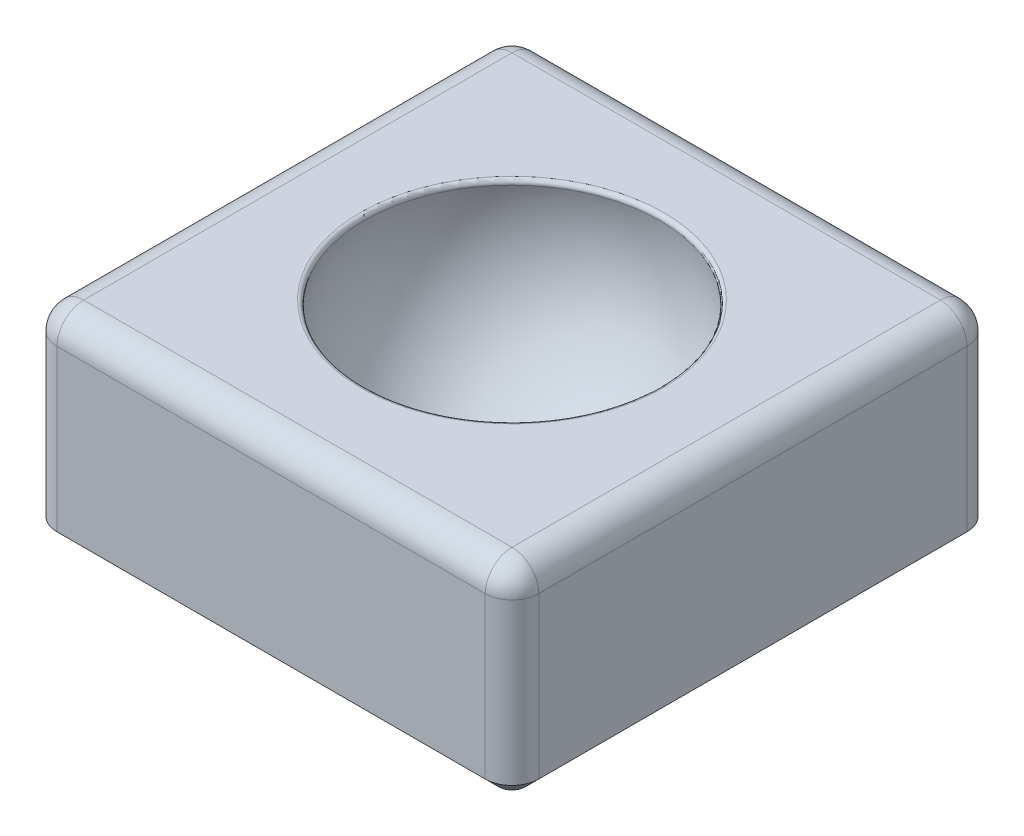
ISO-10303-21;
HEADER;
FILE_DESCRIPTION(('STEP AP214'),'2;1');
FILE_NAME('part.step','',(''),(''),'','','');
FILE_SCHEMA(('AUTOMOTIVE_DESIGN { 1 0 10303 214 1 1 1 1 }'));
ENDSEC;
DATA;
#1=APPLICATION_CONTEXT('core data for automotive mechanical design processes');
#2=APPLICATION_PROTOCOL_DEFINITION('international standard','automotive_design',2000,#1);
#3=PRODUCT_CONTEXT('',#1,'mechanical');
#4=PRODUCT('Part','Part','',(#3));
#5=PRODUCT_RELATED_PRODUCT_CATEGORY('part','',(#4));
#6=PRODUCT_DEFINITION_FORMATION('','',#4);
#7=PRODUCT_DEFINITION_CONTEXT('part definition',#1,'design');
#8=PRODUCT_DEFINITION('design','',#6,#7);
#9=PRODUCT_DEFINITION_SHAPE('','',#8);
#10=(LENGTH_UNIT() NAMED_UNIT(*) SI_UNIT(.MILLI.,.METRE.));
#11=(NAMED_UNIT(*) PLANE_ANGLE_UNIT() SI_UNIT($,.RADIAN.));
#12=(NAMED_UNIT(*) SI_UNIT($,.STERADIAN.) SOLID_ANGLE_UNIT());
#13=UNCERTAINTY_MEASURE_WITH_UNIT(LENGTH_MEASURE(1.E-05),#10,'distance_accuracy_value','');
#14=(GEOMETRIC_REPRESENTATION_CONTEXT(3) GLOBAL_UNCERTAINTY_ASSIGNED_CONTEXT((#13)) GLOBAL_UNIT_ASSIGNED_CONTEXT((#10,
#11,#12)) REPRESENTATION_CONTEXT('',''));
#15=CARTESIAN_POINT('',(0.,0.,0.));
#16=DIRECTION('',(0.,0.,1.));
#17=DIRECTION('',(1.,0.,0.));
#18=AXIS2_PLACEMENT_3D('',#15,#16,#17);
#19=CARTESIAN_POINT('',(18.,15.,18.));
#20=DIRECTION('',(-1.,0.,0.));
#21=DIRECTION('',(0.,0.,1.));
#22=AXIS2_PLACEMENT_3D('',#19,#20,#21);
#23=PLANE('',#22);
#24=DIRECTION('',(0.,-1.,0.));
#25=VECTOR('',#24,1.);
#26=CARTESIAN_POINT('',(18.,15.,16.));
#27=LINE('',#26,#25);
#28=CARTESIAN_POINT('',(18.,13.,16.));
#29=VERTEX_POINT('',#28);
#30=CARTESIAN_POINT('',(18.,1.,16.));
#31=VERTEX_POINT('',#30);
#32=EDGE_CURVE('E202',#29,#31,#27,.T.);
#33=ORIENTED_EDGE('',*,*,#32,.T.);
#34=DIRECTION('',(0.,0.,-1.));
#35=VECTOR('',#34,1.);
#36=CARTESIAN_POINT('',(18.,1.,-16.));
#37=LINE('',#36,#35);
#38=CARTESIAN_POINT('',(18.,1.,-16.));
#39=VERTEX_POINT('',#38);
#40=EDGE_CURVE('E307',#31,#39,#37,.T.);
#41=ORIENTED_EDGE('',*,*,#40,.T.);
#42=DIRECTION('',(0.,-1.,0.));
#43=VECTOR('',#42,1.);
#44=CARTESIAN_POINT('',(18.,15.,-16.));
#45=LINE('',#44,#43);
#46=CARTESIAN_POINT('',(18.,13.,-16.));
#47=VERTEX_POINT('',#46);
#48=EDGE_CURVE('E209',#39,#47,#45,.F.);
#49=ORIENTED_EDGE('',*,*,#48,.T.);
#50=DIRECTION('',(0.,0.,-1.));
#51=VECTOR('',#50,1.);
#52=CARTESIAN_POINT('',(18.,13.,18.));
#53=LINE('',#52,#51);
#54=EDGE_CURVE('E206',#47,#29,#53,.F.);
#55=ORIENTED_EDGE('',*,*,#54,.T.);
#56=EDGE_LOOP('',(#33,#41,#49,#55));
#57=FACE_BOUND('',#56,.T.);
#58=ADVANCED_FACE('F40',(#57),#23,.F.);
#59=CARTESIAN_POINT('',(-18.,15.,-18.));
#60=DIRECTION('',(0.,0.,1.));
#61=DIRECTION('',(1.,0.,0.));
#62=AXIS2_PLACEMENT_3D('',#59,#60,#61);
#63=PLANE('',#62);
#64=DIRECTION('',(0.,-1.,0.));
#65=VECTOR('',#64,1.);
#66=CARTESIAN_POINT('',(16.,15.,-18.));
#67=LINE('',#66,#65);
#68=CARTESIAN_POINT('',(16.,13.,-18.));
#69=VERTEX_POINT('',#68);
#70=CARTESIAN_POINT('',(16.,1.,-18.));
#71=VERTEX_POINT('',#70);
#72=EDGE_CURVE('E189',#69,#71,#67,.T.);
#73=ORIENTED_EDGE('',*,*,#72,.T.);
#74=DIRECTION('',(-1.,0.,0.));
#75=VECTOR('',#74,1.);
#76=CARTESIAN_POINT('',(-16.,1.,-18.));
#77=LINE('',#76,#75);
#78=CARTESIAN_POINT('',(-16.,1.,-18.));
#79=VERTEX_POINT('',#78);
#80=EDGE_CURVE('E67',#71,#79,#77,.T.);
#81=ORIENTED_EDGE('',*,*,#80,.T.);
#82=DIRECTION('',(0.,-1.,0.));
#83=VECTOR('',#82,1.);
#84=CARTESIAN_POINT('',(-16.,15.,-18.));
#85=LINE('',#84,#83);
#86=CARTESIAN_POINT('',(-16.,13.,-18.));
#87=VERTEX_POINT('',#86);
#88=EDGE_CURVE('E199',#79,#87,#85,.F.);
#89=ORIENTED_EDGE('',*,*,#88,.T.);
#90=DIRECTION('',(-1.,0.,0.));
#91=VECTOR('',#90,1.);
#92=CARTESIAN_POINT('',(-18.,13.,-18.));
#93=LINE('',#92,#91);
#94=EDGE_CURVE('E154',#87,#69,#93,.F.);
#95=ORIENTED_EDGE('',*,*,#94,.T.);
#96=EDGE_LOOP('',(#73,#81,#89,#95));
#97=FACE_BOUND('',#96,.T.);
#98=ADVANCED_FACE('F363',(#97),#63,.F.);
#99=CARTESIAN_POINT('',(-18.,15.,18.));
#100=DIRECTION('',(1.,0.,0.));
#101=DIRECTION('',(0.,0.,-1.));
#102=AXIS2_PLACEMENT_3D('',#99,#100,#101);
#103=PLANE('',#102);
#104=DIRECTION('',(0.,-1.,0.));
#105=VECTOR('',#104,1.);
#106=CARTESIAN_POINT('',(-18.,15.,-16.));
#107=LINE('',#106,#105);
#108=CARTESIAN_POINT('',(-18.,13.,-16.));
#109=VERTEX_POINT('',#108);
#110=CARTESIAN_POINT('',(-18.,1.,-16.));
#111=VERTEX_POINT('',#110);
#112=EDGE_CURVE('E228',#109,#111,#107,.T.);
#113=ORIENTED_EDGE('',*,*,#112,.T.);
#114=DIRECTION('',(0.,0.,1.));
#115=VECTOR('',#114,1.);
#116=CARTESIAN_POINT('',(-18.,1.,16.));
#117=LINE('',#116,#115);
#118=CARTESIAN_POINT('',(-18.,1.,16.));
#119=VERTEX_POINT('',#118);
#120=EDGE_CURVE('E51',#111,#119,#117,.T.);
#121=ORIENTED_EDGE('',*,*,#120,.T.);
#122=DIRECTION('',(0.,-1.,0.));
#123=VECTOR('',#122,1.);
#124=CARTESIAN_POINT('',(-18.,15.,16.));
#125=LINE('',#124,#123);
#126=CARTESIAN_POINT('',(-18.,13.,16.));
#127=VERTEX_POINT('',#126);
#128=EDGE_CURVE('E222',#119,#127,#125,.F.);
#129=ORIENTED_EDGE('',*,*,#128,.T.);
#130=DIRECTION('',(0.,0.,1.));
#131=VECTOR('',#130,1.);
#132=CARTESIAN_POINT('',(-18.,13.,18.));
#133=LINE('',#132,#131);
#134=EDGE_CURVE('E225',#127,#109,#133,.F.);
#135=ORIENTED_EDGE('',*,*,#134,.T.);
#136=EDGE_LOOP('',(#113,#121,#129,#135));
#137=FACE_BOUND('',#136,.T.);
#138=ADVANCED_FACE('F368',(#137),#103,.F.);
#139=CARTESIAN_POINT('',(-18.,15.,18.));
#140=DIRECTION('',(0.,0.,-1.));
#141=DIRECTION('',(-1.,0.,0.));
#142=AXIS2_PLACEMENT_3D('',#139,#140,#141);
#143=PLANE('',#142);
#144=DIRECTION('',(0.,-1.,0.));
#145=VECTOR('',#144,1.);
#146=CARTESIAN_POINT('',(-16.,15.,18.));
#147=LINE('',#146,#145);
#148=CARTESIAN_POINT('',(-16.,13.,18.));
#149=VERTEX_POINT('',#148);
#150=CARTESIAN_POINT('',(-16.,1.,18.));
#151=VERTEX_POINT('',#150);
#152=EDGE_CURVE('E218',#149,#151,#147,.T.);
#153=ORIENTED_EDGE('',*,*,#152,.T.);
#154=DIRECTION('',(1.,0.,0.));
#155=VECTOR('',#154,1.);
#156=CARTESIAN_POINT('',(16.,1.,18.));
#157=LINE('',#156,#155);
#158=CARTESIAN_POINT('',(16.,1.,18.));
#159=VERTEX_POINT('',#158);
#160=EDGE_CURVE('E301',#151,#159,#157,.T.);
#161=ORIENTED_EDGE('',*,*,#160,.T.);
#162=DIRECTION('',(0.,-1.,0.));
#163=VECTOR('',#162,1.);
#164=CARTESIAN_POINT('',(16.,15.,18.));
#165=LINE('',#164,#163);
#166=CARTESIAN_POINT('',(16.,13.,18.));
#167=VERTEX_POINT('',#166);
#168=EDGE_CURVE('E212',#159,#167,#165,.F.);
#169=ORIENTED_EDGE('',*,*,#168,.T.);
#170=DIRECTION('',(1.,0.,0.));
#171=VECTOR('',#170,1.);
#172=CARTESIAN_POINT('',(-18.,13.,18.));
#173=LINE('',#172,#171);
#174=EDGE_CURVE('E215',#167,#149,#173,.F.);
#175=ORIENTED_EDGE('',*,*,#174,.T.);
#176=EDGE_LOOP('',(#153,#161,#169,#175));
#177=FACE_BOUND('',#176,.T.);
#178=ADVANCED_FACE('F390',(#177),#143,.F.);
#179=CARTESIAN_POINT('',(0.,15.,0.));
#180=DIRECTION('',(0.,-1.,0.));
#181=DIRECTION('',(0.,0.,-1.));
#182=AXIS2_PLACEMENT_3D('',#179,#180,#181);
#183=PLANE('',#182);
#184=DIRECTION('',(0.,0.,-1.));
#185=VECTOR('',#184,1.);
#186=CARTESIAN_POINT('',(16.,15.,0.));
#187=LINE('',#186,#185);
#188=CARTESIAN_POINT('',(16.,15.,16.));
#189=VERTEX_POINT('',#188);
#190=CARTESIAN_POINT('',(16.,15.,-16.));
#191=VERTEX_POINT('',#190);
#192=EDGE_CURVE('E186',#189,#191,#187,.T.);
#193=ORIENTED_EDGE('',*,*,#192,.T.);
#194=DIRECTION('',(-1.,0.,0.));
#195=VECTOR('',#194,1.);
#196=CARTESIAN_POINT('',(0.,15.,-16.));
#197=LINE('',#196,#195);
#198=CARTESIAN_POINT('',(-16.,15.,-16.));
#199=VERTEX_POINT('',#198);
#200=EDGE_CURVE('E152',#191,#199,#197,.T.);
#201=ORIENTED_EDGE('',*,*,#200,.T.);
#202=DIRECTION('',(0.,0.,1.));
#203=VECTOR('',#202,1.);
#204=CARTESIAN_POINT('',(-16.,15.,0.));
#205=LINE('',#204,#203);
#206=CARTESIAN_POINT('',(-16.,15.,16.));
#207=VERTEX_POINT('',#206);
#208=EDGE_CURVE('E173',#199,#207,#205,.T.);
#209=ORIENTED_EDGE('',*,*,#208,.T.);
#210=DIRECTION('',(1.,0.,0.));
#211=VECTOR('',#210,1.);
#212=CARTESIAN_POINT('',(0.,15.,16.));
#213=LINE('',#212,#211);
#214=EDGE_CURVE('E180',#207,#189,#213,.T.);
#215=ORIENTED_EDGE('',*,*,#214,.T.);
#216=EDGE_LOOP('',(#193,#201,#209,#215));
#217=FACE_BOUND('',#216,.T.);
#218=CARTESIAN_POINT('',(0.,15.,0.));
#219=DIRECTION('',(0.,-1.,0.));
#220=DIRECTION('',(0.,0.,-1.));
#221=AXIS2_PLACEMENT_3D('',#218,#219,#220);
#222=CIRCLE('',#221,11.3328063602975);
#223=CARTESIAN_POINT('',(0.,15.,-11.3328063602975));
#224=VERTEX_POINT('',#223);
#225=EDGE_CURVE('E181',#224,#224,#222,.T.);
#226=ORIENTED_EDGE('',*,*,#225,.T.);
#227=EDGE_LOOP('',(#226));
#228=FACE_BOUND('',#227,.T.);
#229=ADVANCED_FACE('F183',(#217,#228),#183,.F.);
#230=CARTESIAN_POINT('',(0.,0.,0.));
#231=DIRECTION('',(0.,-1.,0.));
#232=DIRECTION('',(0.,0.,-1.));
#233=AXIS2_PLACEMENT_3D('',#230,#231,#232);
#234=PLANE('',#233);
#235=DIRECTION('',(-1.,0.,0.));
#236=VECTOR('',#235,1.);
#237=CARTESIAN_POINT('',(-16.,0.,17.));
#238=LINE('',#237,#236);
#239=CARTESIAN_POINT('',(16.,0.,17.));
#240=VERTEX_POINT('',#239);
#241=CARTESIAN_POINT('',(-16.,0.,17.));
#242=VERTEX_POINT('',#241);
#243=EDGE_CURVE('E290',#240,#242,#238,.T.);
#244=ORIENTED_EDGE('',*,*,#243,.T.);
#245=CARTESIAN_POINT('',(-16.,0.,16.));
#246=DIRECTION('',(0.,-1.,0.));
#247=DIRECTION('',(0.,0.,-1.));
#248=AXIS2_PLACEMENT_3D('',#245,#246,#247);
#249=CIRCLE('',#248,0.999999999999997);
#250=CARTESIAN_POINT('',(-17.,0.,16.));
#251=VERTEX_POINT('',#250);
#252=EDGE_CURVE('E293',#242,#251,#249,.T.);
#253=ORIENTED_EDGE('',*,*,#252,.T.);
#254=DIRECTION('',(0.,0.,-1.));
#255=VECTOR('',#254,1.);
#256=CARTESIAN_POINT('',(-17.,0.,-16.));
#257=LINE('',#256,#255);
#258=CARTESIAN_POINT('',(-17.,0.,-16.));
#259=VERTEX_POINT('',#258);
#260=EDGE_CURVE('E272',#251,#259,#257,.T.);
#261=ORIENTED_EDGE('',*,*,#260,.T.);
#262=CARTESIAN_POINT('',(-16.,0.,-16.));
#263=DIRECTION('',(0.,-1.,0.));
#264=DIRECTION('',(0.,0.,-1.));
#265=AXIS2_PLACEMENT_3D('',#262,#263,#264);
#266=CIRCLE('',#265,0.999999999999997);
#267=CARTESIAN_POINT('',(-16.,0.,-17.));
#268=VERTEX_POINT('',#267);
#269=EDGE_CURVE('E275',#259,#268,#266,.T.);
#270=ORIENTED_EDGE('',*,*,#269,.T.);
#271=DIRECTION('',(1.,0.,0.));
#272=VECTOR('',#271,1.);
#273=CARTESIAN_POINT('',(16.,0.,-17.));
#274=LINE('',#273,#272);
#275=CARTESIAN_POINT('',(16.,0.,-17.));
#276=VERTEX_POINT('',#275);
#277=EDGE_CURVE('E278',#268,#276,#274,.T.);
#278=ORIENTED_EDGE('',*,*,#277,.T.);
#279=CARTESIAN_POINT('',(16.,0.,-16.));
#280=DIRECTION('',(0.,-1.,0.));
#281=DIRECTION('',(0.,0.,-1.));
#282=AXIS2_PLACEMENT_3D('',#279,#280,#281);
#283=CIRCLE('',#282,0.999999999999997);
#284=CARTESIAN_POINT('',(17.,0.,-16.));
#285=VERTEX_POINT('',#284);
#286=EDGE_CURVE('E281',#276,#285,#283,.T.);
#287=ORIENTED_EDGE('',*,*,#286,.T.);
#288=DIRECTION('',(0.,0.,1.));
#289=VECTOR('',#288,1.);
#290=CARTESIAN_POINT('',(17.,0.,16.));
#291=LINE('',#290,#289);
#292=CARTESIAN_POINT('',(17.,0.,16.));
#293=VERTEX_POINT('',#292);
#294=EDGE_CURVE('E284',#285,#293,#291,.T.);
#295=ORIENTED_EDGE('',*,*,#294,.T.);
#296=CARTESIAN_POINT('',(16.,0.,16.));
#297=DIRECTION('',(0.,-1.,0.));
#298=DIRECTION('',(0.,0.,-1.));
#299=AXIS2_PLACEMENT_3D('',#296,#297,#298);
#300=CIRCLE('',#299,0.999999999999997);
#301=EDGE_CURVE('E287',#293,#240,#300,.T.);
#302=ORIENTED_EDGE('',*,*,#301,.T.);
#303=EDGE_LOOP('',(#244,#253,#261,#270,#278,#287,#295,#302));
#304=FACE_BOUND('',#303,.T.);
#305=CARTESIAN_POINT('',(0.,0.,0.));
#306=DIRECTION('',(0.,-1.,0.));
#307=DIRECTION('',(0.,0.,-1.));
#308=AXIS2_PLACEMENT_3D('',#305,#306,#307);
#309=CIRCLE('',#308,4.);
#310=CARTESIAN_POINT('',(0.,0.,-4.));
#311=VERTEX_POINT('',#310);
#312=EDGE_CURVE('E230',#311,#311,#309,.F.);
#313=ORIENTED_EDGE('',*,*,#312,.T.);
#314=EDGE_LOOP('',(#313));
#315=FACE_BOUND('',#314,.T.);
#316=ADVANCED_FACE('F446',(#304,#315),#234,.T.);
#317=CARTESIAN_POINT('',(0.,12.,0.));
#318=DIRECTION('',(-1.,0.,0.));
#319=DIRECTION('',(0.,0.,-1.));
#320=AXIS2_PLACEMENT_3D('',#317,#318,#319);
#321=SPHERICAL_SURFACE('',#320,11.35);
#322=CARTESIAN_POINT('',(0.,12.,0.));
#323=DIRECTION('',(0.,1.,0.));
#324=DIRECTION('',(0.,0.,1.));
#325=AXIS2_PLACEMENT_3D('',#322,#323,#324);
#326=SPHERICAL_SURFACE('',#325,11.35);
#327=CARTESIAN_POINT('',(0.,1.05365357756297,0.));
#328=DIRECTION('',(0.,1.,0.));
#329=DIRECTION('',(0.,0.,1.));
#330=AXIS2_PLACEMENT_3D('',#327,#328,#329);
#331=CIRCLE('',#330,3.);
#332=CARTESIAN_POINT('',(0.,1.05365357756297,3.));
#333=VERTEX_POINT('',#332);
#334=EDGE_CURVE('E159',#333,#333,#331,.T.);
#335=ORIENTED_EDGE('',*,*,#334,.F.);
#336=EDGE_LOOP('',(#335));
#337=FACE_BOUND('',#336,.T.);
#338=CARTESIAN_POINT('',(0.,14.6304721030043,0.));
#339=DIRECTION('',(0.,-1.,0.));
#340=DIRECTION('',(0.,0.,-1.));
#341=AXIS2_PLACEMENT_3D('',#338,#339,#340);
#342=CIRCLE('',#341,11.0409744368564);
#343=CARTESIAN_POINT('',(0.,14.6304721030043,-11.0409744368564));
#344=VERTEX_POINT('',#343);
#345=EDGE_CURVE('E265',#344,#344,#342,.F.);
#346=ORIENTED_EDGE('',*,*,#345,.T.);
#347=EDGE_LOOP('',(#346));
#348=FACE_BOUND('',#347,.T.);
#349=ADVANCED_FACE('F430',(#337,#348),#326,.F.);
#350=CARTESIAN_POINT('',(0.,14.7,0.));
#351=DIRECTION('',(0.,-1.,0.));
#352=DIRECTION('',(0.,0.,-1.));
#353=AXIS2_PLACEMENT_3D('',#350,#351,#352);
#354=TOROIDAL_SURFACE('',#353,11.3328063602975,0.3);
#355=ORIENTED_EDGE('',*,*,#225,.F.);
#356=EDGE_LOOP('',(#355));
#357=FACE_BOUND('',#356,.T.);
#358=ORIENTED_EDGE('',*,*,#345,.F.);
#359=EDGE_LOOP('',(#358));
#360=FACE_BOUND('',#359,.T.);
#361=ADVANCED_FACE('F427',(#357,#360),#354,.T.);
#362=CARTESIAN_POINT('',(16.,15.,16.));
#363=DIRECTION('',(0.,-1.,0.));
#364=DIRECTION('',(0.,0.,-1.));
#365=AXIS2_PLACEMENT_3D('',#362,#363,#364);
#366=CYLINDRICAL_SURFACE('',#365,2.);
#367=ORIENTED_EDGE('',*,*,#168,.F.);
#368=CARTESIAN_POINT('',(16.,1.,16.));
#369=DIRECTION('',(0.,-1.,0.));
#370=DIRECTION('',(0.,0.,-1.));
#371=AXIS2_PLACEMENT_3D('',#368,#369,#370);
#372=CIRCLE('',#371,2.);
#373=EDGE_CURVE('E304',#159,#31,#372,.F.);
#374=ORIENTED_EDGE('',*,*,#373,.T.);
#375=ORIENTED_EDGE('',*,*,#32,.F.);
#376=CARTESIAN_POINT('',(16.,13.,16.));
#377=DIRECTION('',(0.,1.,0.));
#378=DIRECTION('',(0.,0.,1.));
#379=AXIS2_PLACEMENT_3D('',#376,#377,#378);
#380=CIRCLE('',#379,2.);
#381=EDGE_CURVE('E261',#167,#29,#380,.T.);
#382=ORIENTED_EDGE('',*,*,#381,.F.);
#383=EDGE_LOOP('',(#367,#374,#375,#382));
#384=FACE_BOUND('',#383,.T.);
#385=ADVANCED_FACE('F400',(#384),#366,.T.);
#386=CARTESIAN_POINT('',(0.,13.,16.));
#387=DIRECTION('',(1.,0.,0.));
#388=DIRECTION('',(0.,0.,-1.));
#389=AXIS2_PLACEMENT_3D('',#386,#387,#388);
#390=CYLINDRICAL_SURFACE('',#389,2.);
#391=CARTESIAN_POINT('',(-16.,13.,16.));
#392=DIRECTION('',(-1.,0.,0.));
#393=DIRECTION('',(0.,0.,1.));
#394=AXIS2_PLACEMENT_3D('',#391,#392,#393);
#395=CIRCLE('',#394,2.);
#396=EDGE_CURVE('E253',#149,#207,#395,.T.);
#397=ORIENTED_EDGE('',*,*,#396,.F.);
#398=ORIENTED_EDGE('',*,*,#174,.F.);
#399=CARTESIAN_POINT('',(16.,13.,16.));
#400=DIRECTION('',(1.,0.,0.));
#401=DIRECTION('',(0.,0.,-1.));
#402=AXIS2_PLACEMENT_3D('',#399,#400,#401);
#403=CIRCLE('',#402,2.);
#404=EDGE_CURVE('E257',#189,#167,#403,.T.);
#405=ORIENTED_EDGE('',*,*,#404,.F.);
#406=ORIENTED_EDGE('',*,*,#214,.F.);
#407=EDGE_LOOP('',(#397,#398,#405,#406));
#408=FACE_BOUND('',#407,.T.);
#409=ADVANCED_FACE('F396',(#408),#390,.T.);
#410=CARTESIAN_POINT('',(-16.,15.,16.));
#411=DIRECTION('',(0.,-1.,0.));
#412=DIRECTION('',(0.,0.,-1.));
#413=AXIS2_PLACEMENT_3D('',#410,#411,#412);
#414=CYLINDRICAL_SURFACE('',#413,2.);
#415=ORIENTED_EDGE('',*,*,#128,.F.);
#416=CARTESIAN_POINT('',(-16.,1.,16.));
#417=DIRECTION('',(0.,-1.,0.));
#418=DIRECTION('',(0.,0.,-1.));
#419=AXIS2_PLACEMENT_3D('',#416,#417,#418);
#420=CIRCLE('',#419,2.);
#421=EDGE_CURVE('E297',#119,#151,#420,.F.);
#422=ORIENTED_EDGE('',*,*,#421,.T.);
#423=ORIENTED_EDGE('',*,*,#152,.F.);
#424=CARTESIAN_POINT('',(-16.,13.,16.));
#425=DIRECTION('',(0.,1.,0.));
#426=DIRECTION('',(0.,0.,1.));
#427=AXIS2_PLACEMENT_3D('',#424,#425,#426);
#428=CIRCLE('',#427,2.);
#429=EDGE_CURVE('E249',#127,#149,#428,.T.);
#430=ORIENTED_EDGE('',*,*,#429,.F.);
#431=EDGE_LOOP('',(#415,#422,#423,#430));
#432=FACE_BOUND('',#431,.T.);
#433=ADVANCED_FACE('F386',(#432),#414,.T.);
#434=CARTESIAN_POINT('',(16.,13.,16.));
#435=DIRECTION('',(0.,0.,1.));
#436=DIRECTION('',(1.,0.,0.));
#437=AXIS2_PLACEMENT_3D('',#434,#435,#436);
#438=SPHERICAL_SURFACE('',#437,2.);
#439=ORIENTED_EDGE('',*,*,#404,.T.);
#440=ORIENTED_EDGE('',*,*,#381,.T.);
#441=CARTESIAN_POINT('',(16.,13.,16.));
#442=DIRECTION('',(0.,0.,1.));
#443=DIRECTION('',(1.,0.,0.));
#444=AXIS2_PLACEMENT_3D('',#441,#442,#443);
#445=CIRCLE('',#444,2.);
#446=EDGE_CURVE('E245',#189,#29,#445,.F.);
#447=ORIENTED_EDGE('',*,*,#446,.F.);
#448=EDGE_LOOP('',(#439,#440,#447));
#449=FACE_BOUND('',#448,.T.);
#450=ADVANCED_FACE('F403',(#449),#438,.T.);
#451=CARTESIAN_POINT('',(-16.,13.,16.));
#452=DIRECTION('',(0.,0.,1.));
#453=DIRECTION('',(1.,0.,0.));
#454=AXIS2_PLACEMENT_3D('',#451,#452,#453);
#455=SPHERICAL_SURFACE('',#454,2.);
#456=ORIENTED_EDGE('',*,*,#429,.T.);
#457=ORIENTED_EDGE('',*,*,#396,.T.);
#458=CARTESIAN_POINT('',(-16.,13.,16.));
#459=DIRECTION('',(0.,0.,1.));
#460=DIRECTION('',(1.,0.,0.));
#461=AXIS2_PLACEMENT_3D('',#458,#459,#460);
#462=CIRCLE('',#461,2.);
#463=EDGE_CURVE('E176',#127,#207,#462,.F.);
#464=ORIENTED_EDGE('',*,*,#463,.F.);
#465=EDGE_LOOP('',(#456,#457,#464));
#466=FACE_BOUND('',#465,.T.);
#467=ADVANCED_FACE('F504',(#466),#455,.T.);
#468=CARTESIAN_POINT('',(16.,15.,-16.));
#469=DIRECTION('',(0.,-1.,0.));
#470=DIRECTION('',(0.,0.,-1.));
#471=AXIS2_PLACEMENT_3D('',#468,#469,#470);
#472=CYLINDRICAL_SURFACE('',#471,2.);
#473=ORIENTED_EDGE('',*,*,#48,.F.);
#474=CARTESIAN_POINT('',(16.,1.,-16.));
#475=DIRECTION('',(0.,-1.,0.));
#476=DIRECTION('',(0.,0.,-1.));
#477=AXIS2_PLACEMENT_3D('',#474,#475,#476);
#478=CIRCLE('',#477,2.);
#479=EDGE_CURVE('E310',#39,#71,#478,.F.);
#480=ORIENTED_EDGE('',*,*,#479,.T.);
#481=ORIENTED_EDGE('',*,*,#72,.F.);
#482=CARTESIAN_POINT('',(16.,13.,-16.));
#483=DIRECTION('',(0.,1.,0.));
#484=DIRECTION('',(0.,0.,1.));
#485=AXIS2_PLACEMENT_3D('',#482,#483,#484);
#486=CIRCLE('',#485,2.);
#487=EDGE_CURVE('E239',#47,#69,#486,.T.);
#488=ORIENTED_EDGE('',*,*,#487,.F.);
#489=EDGE_LOOP('',(#473,#480,#481,#488));
#490=FACE_BOUND('',#489,.T.);
#491=ADVANCED_FACE('F361',(#490),#472,.T.);
#492=CARTESIAN_POINT('',(16.,13.,0.));
#493=DIRECTION('',(0.,0.,-1.));
#494=DIRECTION('',(-1.,0.,0.));
#495=AXIS2_PLACEMENT_3D('',#492,#493,#494);
#496=CYLINDRICAL_SURFACE('',#495,2.);
#497=ORIENTED_EDGE('',*,*,#446,.T.);
#498=ORIENTED_EDGE('',*,*,#54,.F.);
#499=CARTESIAN_POINT('',(16.,13.,-16.));
#500=DIRECTION('',(0.,0.,-1.));
#501=DIRECTION('',(-1.,0.,0.));
#502=AXIS2_PLACEMENT_3D('',#499,#500,#501);
#503=CIRCLE('',#502,2.);
#504=EDGE_CURVE('E170',#191,#47,#503,.T.);
#505=ORIENTED_EDGE('',*,*,#504,.F.);
#506=ORIENTED_EDGE('',*,*,#192,.F.);
#507=EDGE_LOOP('',(#497,#498,#505,#506));
#508=FACE_BOUND('',#507,.T.);
#509=ADVANCED_FACE('F406',(#508),#496,.T.);
#510=CARTESIAN_POINT('',(-16.,13.,0.));
#511=DIRECTION('',(0.,0.,1.));
#512=DIRECTION('',(1.,0.,0.));
#513=AXIS2_PLACEMENT_3D('',#510,#511,#512);
#514=CYLINDRICAL_SURFACE('',#513,2.);
#515=ORIENTED_EDGE('',*,*,#463,.T.);
#516=ORIENTED_EDGE('',*,*,#208,.F.);
#517=CARTESIAN_POINT('',(-16.,13.,-16.));
#518=DIRECTION('',(0.,0.,-1.));
#519=DIRECTION('',(0.,1.,0.));
#520=AXIS2_PLACEMENT_3D('',#517,#518,#519);
#521=CIRCLE('',#520,2.);
#522=EDGE_CURVE('E162',#109,#199,#521,.T.);
#523=ORIENTED_EDGE('',*,*,#522,.F.);
#524=ORIENTED_EDGE('',*,*,#134,.F.);
#525=EDGE_LOOP('',(#515,#516,#523,#524));
#526=FACE_BOUND('',#525,.T.);
#527=ADVANCED_FACE('F174',(#526),#514,.T.);
#528=CARTESIAN_POINT('',(-16.,15.,-16.));
#529=DIRECTION('',(0.,-1.,0.));
#530=DIRECTION('',(0.,0.,-1.));
#531=AXIS2_PLACEMENT_3D('',#528,#529,#530);
#532=CYLINDRICAL_SURFACE('',#531,2.);
#533=ORIENTED_EDGE('',*,*,#88,.F.);
#534=CARTESIAN_POINT('',(-16.,1.,-16.));
#535=DIRECTION('',(0.,-1.,0.));
#536=DIRECTION('',(0.,0.,-1.));
#537=AXIS2_PLACEMENT_3D('',#534,#535,#536);
#538=CIRCLE('',#537,2.);
#539=EDGE_CURVE('E59',#79,#111,#538,.F.);
#540=ORIENTED_EDGE('',*,*,#539,.T.);
#541=ORIENTED_EDGE('',*,*,#112,.F.);
#542=CARTESIAN_POINT('',(-16.,13.,-16.));
#543=DIRECTION('',(0.,1.,0.));
#544=DIRECTION('',(0.,0.,1.));
#545=AXIS2_PLACEMENT_3D('',#542,#543,#544);
#546=CIRCLE('',#545,2.);
#547=EDGE_CURVE('E166',#87,#109,#546,.T.);
#548=ORIENTED_EDGE('',*,*,#547,.F.);
#549=EDGE_LOOP('',(#533,#540,#541,#548));
#550=FACE_BOUND('',#549,.T.);
#551=ADVANCED_FACE('F365',(#550),#532,.T.);
#552=CARTESIAN_POINT('',(16.,13.,-16.));
#553=DIRECTION('',(1.,0.,0.));
#554=DIRECTION('',(0.,0.,-1.));
#555=AXIS2_PLACEMENT_3D('',#552,#553,#554);
#556=SPHERICAL_SURFACE('',#555,2.);
#557=ORIENTED_EDGE('',*,*,#504,.T.);
#558=ORIENTED_EDGE('',*,*,#487,.T.);
#559=CARTESIAN_POINT('',(16.,13.,-16.));
#560=DIRECTION('',(1.,0.,0.));
#561=DIRECTION('',(0.,1.,0.));
#562=AXIS2_PLACEMENT_3D('',#559,#560,#561);
#563=CIRCLE('',#562,2.);
#564=EDGE_CURVE('E158',#191,#69,#563,.F.);
#565=ORIENTED_EDGE('',*,*,#564,.F.);
#566=EDGE_LOOP('',(#557,#558,#565));
#567=FACE_BOUND('',#566,.T.);
#568=ADVANCED_FACE('F409',(#567),#556,.T.);
#569=CARTESIAN_POINT('',(-16.,13.,-16.));
#570=DIRECTION('',(-1.,0.,0.));
#571=DIRECTION('',(0.,0.,1.));
#572=AXIS2_PLACEMENT_3D('',#569,#570,#571);
#573=SPHERICAL_SURFACE('',#572,2.);
#574=ORIENTED_EDGE('',*,*,#547,.T.);
#575=ORIENTED_EDGE('',*,*,#522,.T.);
#576=CARTESIAN_POINT('',(-16.,13.,-16.));
#577=DIRECTION('',(-1.,0.,0.));
#578=DIRECTION('',(0.,0.,1.));
#579=AXIS2_PLACEMENT_3D('',#576,#577,#578);
#580=CIRCLE('',#579,2.);
#581=EDGE_CURVE('E148',#87,#199,#580,.F.);
#582=ORIENTED_EDGE('',*,*,#581,.F.);
#583=EDGE_LOOP('',(#574,#575,#582));
#584=FACE_BOUND('',#583,.T.);
#585=ADVANCED_FACE('F164',(#584),#573,.T.);
#586=CARTESIAN_POINT('',(0.,13.,-16.));
#587=DIRECTION('',(-1.,0.,0.));
#588=DIRECTION('',(0.,0.,1.));
#589=AXIS2_PLACEMENT_3D('',#586,#587,#588);
#590=CYLINDRICAL_SURFACE('',#589,2.);
#591=ORIENTED_EDGE('',*,*,#564,.T.);
#592=ORIENTED_EDGE('',*,*,#94,.F.);
#593=ORIENTED_EDGE('',*,*,#581,.T.);
#594=ORIENTED_EDGE('',*,*,#200,.F.);
#595=EDGE_LOOP('',(#591,#592,#593,#594));
#596=FACE_BOUND('',#595,.T.);
#597=ADVANCED_FACE('F150',(#596),#590,.T.);
#598=CARTESIAN_POINT('',(0.,10.,0.));
#599=DIRECTION('',(0.,-1.,0.));
#600=DIRECTION('',(0.,0.,-1.));
#601=AXIS2_PLACEMENT_3D('',#598,#599,#600);
#602=CYLINDRICAL_SURFACE('',#601,3.);
#603=CARTESIAN_POINT('',(0.,0.999999999999999,0.));
#604=DIRECTION('',(0.,-1.,0.));
#605=DIRECTION('',(0.,0.,-1.));
#606=AXIS2_PLACEMENT_3D('',#603,#604,#605);
#607=CIRCLE('',#606,3.);
#608=CARTESIAN_POINT('',(0.,0.999999999999999,-3.));
#609=VERTEX_POINT('',#608);
#610=EDGE_CURVE('E11',#609,#609,#607,.T.);
#611=ORIENTED_EDGE('',*,*,#610,.T.);
#612=EDGE_LOOP('',(#611));
#613=FACE_BOUND('',#612,.T.);
#614=ORIENTED_EDGE('',*,*,#334,.T.);
#615=EDGE_LOOP('',(#614));
#616=FACE_BOUND('',#615,.T.);
#617=ADVANCED_FACE('F433',(#613,#616),#602,.F.);
#618=CARTESIAN_POINT('',(16.,0.,-16.));
#619=DIRECTION('',(0.,1.,0.));
#620=DIRECTION('',(0.,0.,1.));
#621=AXIS2_PLACEMENT_3D('',#618,#619,#620);
#622=CONICAL_SURFACE('',#621,0.999999999999997,0.785398163397449);
#623=DIRECTION('',(0.,-0.707106781186546,0.707106781186549));
#624=VECTOR('',#623,1.);
#625=CARTESIAN_POINT('',(16.,1.,-18.));
#626=LINE('',#625,#624);
#627=EDGE_CURVE('E340',#71,#276,#626,.T.);
#628=ORIENTED_EDGE('',*,*,#627,.F.);
#629=ORIENTED_EDGE('',*,*,#479,.F.);
#630=DIRECTION('',(0.707106781186547,0.707106781186548,0.));
#631=VECTOR('',#630,1.);
#632=CARTESIAN_POINT('',(17.,0.,-16.));
#633=LINE('',#632,#631);
#634=EDGE_CURVE('E45',#285,#39,#633,.T.);
#635=ORIENTED_EDGE('',*,*,#634,.F.);
#636=ORIENTED_EDGE('',*,*,#286,.F.);
#637=EDGE_LOOP('',(#628,#629,#635,#636));
#638=FACE_BOUND('',#637,.T.);
#639=ADVANCED_FACE('F357',(#638),#622,.T.);
#640=CARTESIAN_POINT('',(18.,1.,18.));
#641=DIRECTION('',(0.707106781186547,-0.707106781186547,0.));
#642=DIRECTION('',(0.,0.,1.));
#643=AXIS2_PLACEMENT_3D('',#640,#641,#642);
#644=PLANE('',#643);
#645=ORIENTED_EDGE('',*,*,#634,.T.);
#646=ORIENTED_EDGE('',*,*,#40,.F.);
#647=DIRECTION('',(0.707106781186547,0.707106781186547,0.));
#648=VECTOR('',#647,1.);
#649=CARTESIAN_POINT('',(17.,0.,16.));
#650=LINE('',#649,#648);
#651=EDGE_CURVE('E337',#293,#31,#650,.T.);
#652=ORIENTED_EDGE('',*,*,#651,.F.);
#653=ORIENTED_EDGE('',*,*,#294,.F.);
#654=EDGE_LOOP('',(#645,#646,#652,#653));
#655=FACE_BOUND('',#654,.T.);
#656=ADVANCED_FACE('F352',(#655),#644,.T.);
#657=CARTESIAN_POINT('',(-18.,1.,-18.));
#658=DIRECTION('',(0.,-0.707106781186547,-0.707106781186547));
#659=DIRECTION('',(1.,0.,0.));
#660=AXIS2_PLACEMENT_3D('',#657,#658,#659);
#661=PLANE('',#660);
#662=ORIENTED_EDGE('',*,*,#627,.T.);
#663=ORIENTED_EDGE('',*,*,#277,.F.);
#664=DIRECTION('',(0.,-0.707106781186547,0.707106781186547));
#665=VECTOR('',#664,1.);
#666=CARTESIAN_POINT('',(-16.,1.,-18.));
#667=LINE('',#666,#665);
#668=EDGE_CURVE('E333',#79,#268,#667,.T.);
#669=ORIENTED_EDGE('',*,*,#668,.F.);
#670=ORIENTED_EDGE('',*,*,#80,.F.);
#671=EDGE_LOOP('',(#662,#663,#669,#670));
#672=FACE_BOUND('',#671,.T.);
#673=ADVANCED_FACE('F554',(#672),#661,.T.);
#674=CARTESIAN_POINT('',(16.,0.,16.));
#675=DIRECTION('',(0.,1.,0.));
#676=DIRECTION('',(0.,0.,1.));
#677=AXIS2_PLACEMENT_3D('',#674,#675,#676);
#678=CONICAL_SURFACE('',#677,0.999999999999997,0.785398163397449);
#679=ORIENTED_EDGE('',*,*,#651,.T.);
#680=ORIENTED_EDGE('',*,*,#373,.F.);
#681=DIRECTION('',(0.,0.707106781186546,0.707106781186549));
#682=VECTOR('',#681,1.);
#683=CARTESIAN_POINT('',(16.,0.,17.));
#684=LINE('',#683,#682);
#685=EDGE_CURVE('E329',#240,#159,#684,.T.);
#686=ORIENTED_EDGE('',*,*,#685,.F.);
#687=ORIENTED_EDGE('',*,*,#301,.F.);
#688=EDGE_LOOP('',(#679,#680,#686,#687));
#689=FACE_BOUND('',#688,.T.);
#690=ADVANCED_FACE('F563',(#689),#678,.T.);
#691=CARTESIAN_POINT('',(-16.,0.,-16.));
#692=DIRECTION('',(0.,1.,0.));
#693=DIRECTION('',(0.,0.,1.));
#694=AXIS2_PLACEMENT_3D('',#691,#692,#693);
#695=CONICAL_SURFACE('',#694,0.999999999999997,0.785398163397449);
#696=ORIENTED_EDGE('',*,*,#668,.T.);
#697=ORIENTED_EDGE('',*,*,#269,.F.);
#698=DIRECTION('',(0.707106781186549,-0.707106781186546,0.));
#699=VECTOR('',#698,1.);
#700=CARTESIAN_POINT('',(-18.,1.,-16.));
#701=LINE('',#700,#699);
#702=EDGE_CURVE('E325',#111,#259,#701,.T.);
#703=ORIENTED_EDGE('',*,*,#702,.F.);
#704=ORIENTED_EDGE('',*,*,#539,.F.);
#705=EDGE_LOOP('',(#696,#697,#703,#704));
#706=FACE_BOUND('',#705,.T.);
#707=ADVANCED_FACE('F373',(#706),#695,.T.);
#708=CARTESIAN_POINT('',(-18.,1.,18.));
#709=DIRECTION('',(0.,-0.707106781186547,0.707106781186547));
#710=DIRECTION('',(-1.,0.,0.));
#711=AXIS2_PLACEMENT_3D('',#708,#709,#710);
#712=PLANE('',#711);
#713=ORIENTED_EDGE('',*,*,#685,.T.);
#714=ORIENTED_EDGE('',*,*,#160,.F.);
#715=DIRECTION('',(0.,0.707106781186547,0.707106781186547));
#716=VECTOR('',#715,1.);
#717=CARTESIAN_POINT('',(-16.,0.,17.));
#718=LINE('',#717,#716);
#719=EDGE_CURVE('E322',#242,#151,#718,.T.);
#720=ORIENTED_EDGE('',*,*,#719,.F.);
#721=ORIENTED_EDGE('',*,*,#243,.F.);
#722=EDGE_LOOP('',(#713,#714,#720,#721));
#723=FACE_BOUND('',#722,.T.);
#724=ADVANCED_FACE('F581',(#723),#712,.T.);
#725=CARTESIAN_POINT('',(-18.,1.,18.));
#726=DIRECTION('',(-0.707106781186547,-0.707106781186547,0.));
#727=DIRECTION('',(0.,0.,-1.));
#728=AXIS2_PLACEMENT_3D('',#725,#726,#727);
#729=PLANE('',#728);
#730=ORIENTED_EDGE('',*,*,#702,.T.);
#731=ORIENTED_EDGE('',*,*,#260,.F.);
#732=DIRECTION('',(0.707106781186547,-0.707106781186547,0.));
#733=VECTOR('',#732,1.);
#734=CARTESIAN_POINT('',(-18.,1.,16.));
#735=LINE('',#734,#733);
#736=EDGE_CURVE('E319',#119,#251,#735,.T.);
#737=ORIENTED_EDGE('',*,*,#736,.F.);
#738=ORIENTED_EDGE('',*,*,#120,.F.);
#739=EDGE_LOOP('',(#730,#731,#737,#738));
#740=FACE_BOUND('',#739,.T.);
#741=ADVANCED_FACE('F377',(#740),#729,.T.);
#742=CARTESIAN_POINT('',(-16.,0.,16.));
#743=DIRECTION('',(0.,1.,0.));
#744=DIRECTION('',(0.,0.,1.));
#745=AXIS2_PLACEMENT_3D('',#742,#743,#744);
#746=CONICAL_SURFACE('',#745,0.999999999999997,0.785398163397449);
#747=ORIENTED_EDGE('',*,*,#719,.T.);
#748=ORIENTED_EDGE('',*,*,#421,.F.);
#749=ORIENTED_EDGE('',*,*,#736,.T.);
#750=ORIENTED_EDGE('',*,*,#252,.F.);
#751=EDGE_LOOP('',(#747,#748,#749,#750));
#752=FACE_BOUND('',#751,.T.);
#753=ADVANCED_FACE('F381',(#752),#746,.T.);
#754=CARTESIAN_POINT('',(0.,0.999999999999999,0.));
#755=DIRECTION('',(0.,-1.,0.));
#756=DIRECTION('',(0.,0.,-1.));
#757=AXIS2_PLACEMENT_3D('',#754,#755,#756);
#758=CONICAL_SURFACE('',#757,3.,0.78539816339745);
#759=ORIENTED_EDGE('',*,*,#312,.F.);
#760=EDGE_LOOP('',(#759));
#761=FACE_BOUND('',#760,.T.);
#762=ORIENTED_EDGE('',*,*,#610,.F.);
#763=EDGE_LOOP('',(#762));
#764=FACE_BOUND('',#763,.T.);
#765=ADVANCED_FACE('F43',(#761,#764),#758,.F.);
#766=CLOSED_SHELL('',(#58,#98,#138,#178,#229,#316,#349,#361,#385,#409,#433,#450,#467,#491,#509,
#527,#551,#568,#585,#597,#617,#639,#656,#673,#690,#707,#724,#741,#753,#765));
#767=MANIFOLD_SOLID_BREP('B2',#766);
#768=ADVANCED_BREP_SHAPE_REPRESENTATION('',(#18,#767),#14);
#769=SHAPE_DEFINITION_REPRESENTATION(#9,#768);
ENDSEC;
END-ISO-10303-21;
